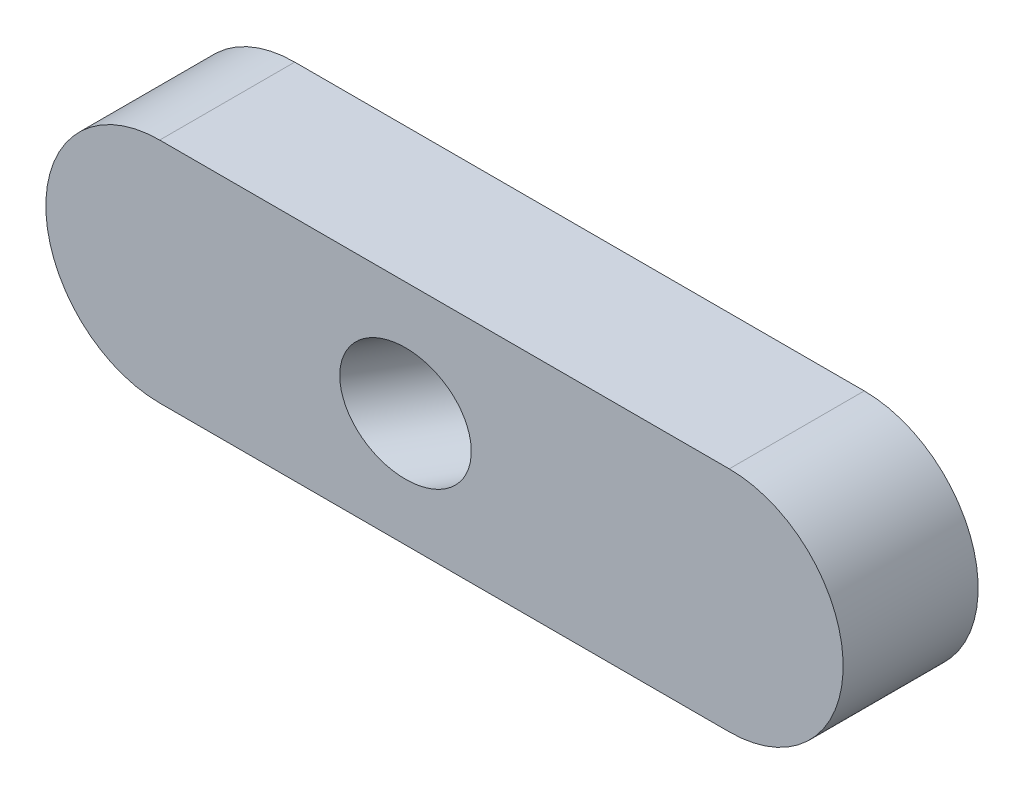
ISO-10303-21;
HEADER;
FILE_DESCRIPTION(('STEP AP214'),'2;1');
FILE_NAME('part.step','',(''),(''),'','','');
FILE_SCHEMA(('AUTOMOTIVE_DESIGN { 1 0 10303 214 1 1 1 1 }'));
ENDSEC;
DATA;
#1=APPLICATION_CONTEXT('core data for automotive mechanical design processes');
#2=APPLICATION_PROTOCOL_DEFINITION('international standard','automotive_design',2000,#1);
#3=PRODUCT_CONTEXT('',#1,'mechanical');
#4=PRODUCT('Part','Part','',(#3));
#5=PRODUCT_RELATED_PRODUCT_CATEGORY('part','',(#4));
#6=PRODUCT_DEFINITION_FORMATION('','',#4);
#7=PRODUCT_DEFINITION_CONTEXT('part definition',#1,'design');
#8=PRODUCT_DEFINITION('design','',#6,#7);
#9=PRODUCT_DEFINITION_SHAPE('','',#8);
#10=(LENGTH_UNIT() NAMED_UNIT(*) SI_UNIT(.MILLI.,.METRE.));
#11=(NAMED_UNIT(*) PLANE_ANGLE_UNIT() SI_UNIT($,.RADIAN.));
#12=(NAMED_UNIT(*) SI_UNIT($,.STERADIAN.) SOLID_ANGLE_UNIT());
#13=UNCERTAINTY_MEASURE_WITH_UNIT(LENGTH_MEASURE(1.E-05),#10,'distance_accuracy_value','');
#14=(GEOMETRIC_REPRESENTATION_CONTEXT(3) GLOBAL_UNCERTAINTY_ASSIGNED_CONTEXT((#13)) GLOBAL_UNIT_ASSIGNED_CONTEXT((#10,
#11,#12)) REPRESENTATION_CONTEXT('',''));
#15=CARTESIAN_POINT('',(0.,0.,0.));
#16=DIRECTION('',(0.,0.,1.));
#17=DIRECTION('',(1.,0.,0.));
#18=AXIS2_PLACEMENT_3D('',#15,#16,#17);
#19=CARTESIAN_POINT('',(-15.,0.,3.556));
#20=DIRECTION('',(0.,0.,-1.));
#21=DIRECTION('',(-1.,0.,0.));
#22=AXIS2_PLACEMENT_3D('',#19,#20,#21);
#23=CYLINDRICAL_SURFACE('',#22,6.00000000000001);
#24=CARTESIAN_POINT('',(-15.,0.,-3.556));
#25=DIRECTION('',(0.,0.,1.));
#26=DIRECTION('',(1.,0.,0.));
#27=AXIS2_PLACEMENT_3D('',#24,#25,#26);
#28=CIRCLE('',#27,6.00000000000001);
#29=CARTESIAN_POINT('',(-15.,6.00000000000001,-3.556));
#30=VERTEX_POINT('',#29);
#31=CARTESIAN_POINT('',(-15.,-6.00000000000001,-3.556));
#32=VERTEX_POINT('',#31);
#33=EDGE_CURVE('E100',#30,#32,#28,.T.);
#34=ORIENTED_EDGE('',*,*,#33,.T.);
#35=DIRECTION('',(0.,0.,-1.));
#36=VECTOR('',#35,1.);
#37=CARTESIAN_POINT('',(-15.,-6.00000000000001,3.556));
#38=LINE('',#37,#36);
#39=CARTESIAN_POINT('',(-15.,-6.00000000000001,3.556));
#40=VERTEX_POINT('',#39);
#41=EDGE_CURVE('E11',#40,#32,#38,.T.);
#42=ORIENTED_EDGE('',*,*,#41,.F.);
#43=CARTESIAN_POINT('',(-15.,0.,3.556));
#44=DIRECTION('',(0.,0.,1.));
#45=DIRECTION('',(1.,0.,0.));
#46=AXIS2_PLACEMENT_3D('',#43,#44,#45);
#47=CIRCLE('',#46,6.00000000000001);
#48=CARTESIAN_POINT('',(-15.,6.00000000000001,3.556));
#49=VERTEX_POINT('',#48);
#50=EDGE_CURVE('E87',#49,#40,#47,.T.);
#51=ORIENTED_EDGE('',*,*,#50,.F.);
#52=DIRECTION('',(0.,0.,-1.));
#53=VECTOR('',#52,1.);
#54=CARTESIAN_POINT('',(-15.,6.00000000000001,3.556));
#55=LINE('',#54,#53);
#56=EDGE_CURVE('E96',#49,#30,#55,.T.);
#57=ORIENTED_EDGE('',*,*,#56,.T.);
#58=EDGE_LOOP('',(#34,#42,#51,#57));
#59=FACE_BOUND('',#58,.T.);
#60=ADVANCED_FACE('F35',(#59),#23,.T.);
#61=CARTESIAN_POINT('',(-15.,-6.00000000000001,3.556));
#62=DIRECTION('',(0.,1.,0.));
#63=DIRECTION('',(-1.,0.,0.));
#64=AXIS2_PLACEMENT_3D('',#61,#62,#63);
#65=PLANE('',#64);
#66=DIRECTION('',(1.,0.,0.));
#67=VECTOR('',#66,1.);
#68=CARTESIAN_POINT('',(-15.,-6.00000000000001,-3.556));
#69=LINE('',#68,#67);
#70=CARTESIAN_POINT('',(15.,-6.,-3.556));
#71=VERTEX_POINT('',#70);
#72=EDGE_CURVE('E91',#32,#71,#69,.T.);
#73=ORIENTED_EDGE('',*,*,#72,.T.);
#74=DIRECTION('',(0.,0.,-1.));
#75=VECTOR('',#74,1.);
#76=CARTESIAN_POINT('',(15.,-6.,3.556));
#77=LINE('',#76,#75);
#78=CARTESIAN_POINT('',(15.,-6.,3.556));
#79=VERTEX_POINT('',#78);
#80=EDGE_CURVE('E44',#79,#71,#77,.T.);
#81=ORIENTED_EDGE('',*,*,#80,.F.);
#82=DIRECTION('',(1.,0.,0.));
#83=VECTOR('',#82,1.);
#84=CARTESIAN_POINT('',(-15.,-6.00000000000001,3.556));
#85=LINE('',#84,#83);
#86=EDGE_CURVE('E82',#40,#79,#85,.T.);
#87=ORIENTED_EDGE('',*,*,#86,.F.);
#88=ORIENTED_EDGE('',*,*,#41,.T.);
#89=EDGE_LOOP('',(#73,#81,#87,#88));
#90=FACE_BOUND('',#89,.T.);
#91=ADVANCED_FACE('F90',(#90),#65,.F.);
#92=CARTESIAN_POINT('',(15.,0.,3.556));
#93=DIRECTION('',(0.,0.,-1.));
#94=DIRECTION('',(-1.,0.,0.));
#95=AXIS2_PLACEMENT_3D('',#92,#93,#94);
#96=CYLINDRICAL_SURFACE('',#95,6.00000000000001);
#97=CARTESIAN_POINT('',(15.,0.,-3.556));
#98=DIRECTION('',(0.,0.,1.));
#99=DIRECTION('',(1.,0.,0.));
#100=AXIS2_PLACEMENT_3D('',#97,#98,#99);
#101=CIRCLE('',#100,6.00000000000001);
#102=CARTESIAN_POINT('',(15.,6.00000000000001,-3.556));
#103=VERTEX_POINT('',#102);
#104=EDGE_CURVE('E69',#71,#103,#101,.T.);
#105=ORIENTED_EDGE('',*,*,#104,.T.);
#106=DIRECTION('',(0.,0.,-1.));
#107=VECTOR('',#106,1.);
#108=CARTESIAN_POINT('',(15.,6.00000000000001,3.556));
#109=LINE('',#108,#107);
#110=CARTESIAN_POINT('',(15.,6.00000000000001,3.556));
#111=VERTEX_POINT('',#110);
#112=EDGE_CURVE('E92',#111,#103,#109,.T.);
#113=ORIENTED_EDGE('',*,*,#112,.F.);
#114=CARTESIAN_POINT('',(15.,0.,3.556));
#115=DIRECTION('',(0.,0.,1.));
#116=DIRECTION('',(1.,0.,0.));
#117=AXIS2_PLACEMENT_3D('',#114,#115,#116);
#118=CIRCLE('',#117,6.00000000000001);
#119=EDGE_CURVE('E85',#79,#111,#118,.T.);
#120=ORIENTED_EDGE('',*,*,#119,.F.);
#121=ORIENTED_EDGE('',*,*,#80,.T.);
#122=EDGE_LOOP('',(#105,#113,#120,#121));
#123=FACE_BOUND('',#122,.T.);
#124=ADVANCED_FACE('F94',(#123),#96,.T.);
#125=CARTESIAN_POINT('',(-15.,6.00000000000001,3.556));
#126=DIRECTION('',(0.,-1.,0.));
#127=DIRECTION('',(1.,0.,0.));
#128=AXIS2_PLACEMENT_3D('',#125,#126,#127);
#129=PLANE('',#128);
#130=DIRECTION('',(-1.,0.,0.));
#131=VECTOR('',#130,1.);
#132=CARTESIAN_POINT('',(-15.,6.00000000000001,-3.556));
#133=LINE('',#132,#131);
#134=EDGE_CURVE('E75',#103,#30,#133,.T.);
#135=ORIENTED_EDGE('',*,*,#134,.T.);
#136=ORIENTED_EDGE('',*,*,#56,.F.);
#137=DIRECTION('',(-1.,0.,0.));
#138=VECTOR('',#137,1.);
#139=CARTESIAN_POINT('',(-15.,6.00000000000001,3.556));
#140=LINE('',#139,#138);
#141=EDGE_CURVE('E52',#111,#49,#140,.T.);
#142=ORIENTED_EDGE('',*,*,#141,.F.);
#143=ORIENTED_EDGE('',*,*,#112,.T.);
#144=EDGE_LOOP('',(#135,#136,#142,#143));
#145=FACE_BOUND('',#144,.T.);
#146=ADVANCED_FACE('F108',(#145),#129,.F.);
#147=CARTESIAN_POINT('',(-15.,0.,3.556));
#148=DIRECTION('',(0.,0.,1.));
#149=DIRECTION('',(1.,0.,0.));
#150=AXIS2_PLACEMENT_3D('',#147,#148,#149);
#151=PLANE('',#150);
#152=CARTESIAN_POINT('',(-2.05305755723831,0.,3.556));
#153=DIRECTION('',(0.,0.,1.));
#154=DIRECTION('',(-1.,0.,0.));
#155=AXIS2_PLACEMENT_3D('',#152,#153,#154);
#156=ELLIPSE('',#155,3.46410161513776,3.);
#157=CARTESIAN_POINT('',(-5.51715917237607,0.,3.556));
#158=VERTEX_POINT('',#157);
#159=EDGE_CURVE('E103',#158,#158,#156,.T.);
#160=ORIENTED_EDGE('',*,*,#159,.F.);
#161=EDGE_LOOP('',(#160));
#162=FACE_BOUND('',#161,.T.);
#163=ORIENTED_EDGE('',*,*,#50,.T.);
#164=ORIENTED_EDGE('',*,*,#86,.T.);
#165=ORIENTED_EDGE('',*,*,#119,.T.);
#166=ORIENTED_EDGE('',*,*,#141,.T.);
#167=EDGE_LOOP('',(#163,#164,#165,#166));
#168=FACE_BOUND('',#167,.T.);
#169=ADVANCED_FACE('F83',(#162,#168),#151,.T.);
#170=CARTESIAN_POINT('',(-15.,0.,-3.556));
#171=DIRECTION('',(0.,0.,1.));
#172=DIRECTION('',(1.,0.,0.));
#173=AXIS2_PLACEMENT_3D('',#170,#171,#172);
#174=PLANE('',#173);
#175=CARTESIAN_POINT('',(2.05305755723831,0.,-3.556));
#176=DIRECTION('',(0.,0.,1.));
#177=DIRECTION('',(-1.,0.,0.));
#178=AXIS2_PLACEMENT_3D('',#175,#176,#177);
#179=ELLIPSE('',#178,3.46410161513776,3.);
#180=CARTESIAN_POINT('',(-1.41104405789944,0.,-3.556));
#181=VERTEX_POINT('',#180);
#182=EDGE_CURVE('E38',#181,#181,#179,.T.);
#183=ORIENTED_EDGE('',*,*,#182,.T.);
#184=EDGE_LOOP('',(#183));
#185=FACE_BOUND('',#184,.T.);
#186=ORIENTED_EDGE('',*,*,#33,.F.);
#187=ORIENTED_EDGE('',*,*,#134,.F.);
#188=ORIENTED_EDGE('',*,*,#104,.F.);
#189=ORIENTED_EDGE('',*,*,#72,.F.);
#190=EDGE_LOOP('',(#186,#187,#188,#189));
#191=FACE_BOUND('',#190,.T.);
#192=ADVANCED_FACE('F111',(#185,#191),#174,.F.);
#193=CARTESIAN_POINT('',(6.78979316792876,0.,-11.7602667397366));
#194=DIRECTION('',(-0.500000000000001,0.,0.866025403784438));
#195=DIRECTION('',(0.866025403784438,0.,0.500000000000001));
#196=AXIS2_PLACEMENT_3D('',#193,#194,#195);
#197=CYLINDRICAL_SURFACE('',#196,3.);
#198=ORIENTED_EDGE('',*,*,#159,.T.);
#199=EDGE_LOOP('',(#198));
#200=FACE_BOUND('',#199,.T.);
#201=ORIENTED_EDGE('',*,*,#182,.F.);
#202=EDGE_LOOP('',(#201));
#203=FACE_BOUND('',#202,.T.);
#204=ADVANCED_FACE('F121',(#200,#203),#197,.F.);
#205=CLOSED_SHELL('',(#60,#91,#124,#146,#169,#192,#204));
#206=MANIFOLD_SOLID_BREP('B2',#205);
#207=ADVANCED_BREP_SHAPE_REPRESENTATION('',(#18,#206),#14);
#208=SHAPE_DEFINITION_REPRESENTATION(#9,#207);
ENDSEC;
END-ISO-10303-21;
